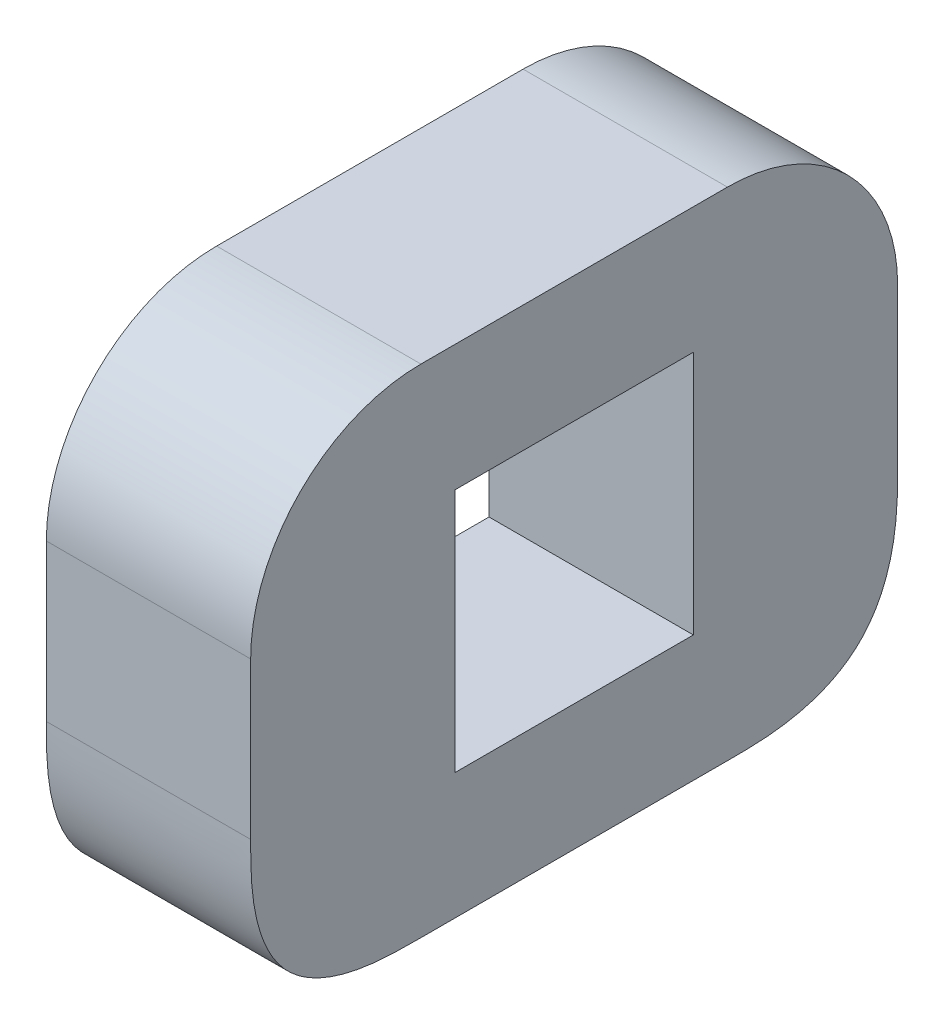
ISO-10303-21;
HEADER;
FILE_DESCRIPTION(('STEP AP214'),'2;1');
FILE_NAME('part.step','',(''),(''),'','','');
FILE_SCHEMA(('AUTOMOTIVE_DESIGN { 1 0 10303 214 1 1 1 1 }'));
ENDSEC;
DATA;
#1=APPLICATION_CONTEXT('core data for automotive mechanical design processes');
#2=APPLICATION_PROTOCOL_DEFINITION('international standard','automotive_design',2000,#1);
#3=PRODUCT_CONTEXT('',#1,'mechanical');
#4=PRODUCT('Part','Part','',(#3));
#5=PRODUCT_RELATED_PRODUCT_CATEGORY('part','',(#4));
#6=PRODUCT_DEFINITION_FORMATION('','',#4);
#7=PRODUCT_DEFINITION_CONTEXT('part definition',#1,'design');
#8=PRODUCT_DEFINITION('design','',#6,#7);
#9=PRODUCT_DEFINITION_SHAPE('','',#8);
#10=(LENGTH_UNIT() NAMED_UNIT(*) SI_UNIT(.MILLI.,.METRE.));
#11=(NAMED_UNIT(*) PLANE_ANGLE_UNIT() SI_UNIT($,.RADIAN.));
#12=(NAMED_UNIT(*) SI_UNIT($,.STERADIAN.) SOLID_ANGLE_UNIT());
#13=UNCERTAINTY_MEASURE_WITH_UNIT(LENGTH_MEASURE(1.E-05),#10,'distance_accuracy_value','');
#14=(GEOMETRIC_REPRESENTATION_CONTEXT(3) GLOBAL_UNCERTAINTY_ASSIGNED_CONTEXT((#13)) GLOBAL_UNIT_ASSIGNED_CONTEXT((#10,
#11,#12)) REPRESENTATION_CONTEXT('',''));
#15=CARTESIAN_POINT('',(0.,0.,0.));
#16=DIRECTION('',(0.,0.,1.));
#17=DIRECTION('',(1.,0.,0.));
#18=AXIS2_PLACEMENT_3D('',#15,#16,#17);
#19=CARTESIAN_POINT('',(60.6809794521981,0.909999999999997,-6.5));
#20=CARTESIAN_POINT('',(58.2809794521982,0.909999999999997,-6.5));
#21=CARTESIAN_POINT('',(55.8809794521981,0.909999999999997,-6.5));
#22=CARTESIAN_POINT('',(53.4809794521981,0.909999999999997,-6.5));
#23=CARTESIAN_POINT('',(60.6809794521981,0.0690097423302654,-6.5));
#24=CARTESIAN_POINT('',(58.2809794521981,0.0690097423307858,-6.50000000000729));
#25=CARTESIAN_POINT('',(55.8809794521982,0.0690097423307858,-6.50000000000729));
#26=CARTESIAN_POINT('',(53.4809794521981,0.0690097423302654,-6.5));
#27=CARTESIAN_POINT('',(60.6809794521981,-0.771980515339466,-6.5));
#28=CARTESIAN_POINT('',(58.2809794521981,-0.771980515339466,-6.50000000001041));
#29=CARTESIAN_POINT('',(55.8809794521982,-0.771980515339466,-6.50000000001041));
#30=CARTESIAN_POINT('',(53.4809794521981,-0.771980515339466,-6.5));
#31=CARTESIAN_POINT('',(60.6809794521981,-2.62553390593274,-6.14154040081959));
#32=CARTESIAN_POINT('',(58.2809794521981,-2.62553390593326,-6.14154040083832));
#33=CARTESIAN_POINT('',(55.8809794521982,-2.62553390593326,-6.14154040083832));
#34=CARTESIAN_POINT('',(53.4809794521981,-2.62553390593274,-6.14154040081959));
#35=CARTESIAN_POINT('',(60.6809794521981,-3.73154040081959,-5.03553390593274));
#36=CARTESIAN_POINT('',(58.2809794521981,-3.7315404008326,-5.03553390593066));
#37=CARTESIAN_POINT('',(55.8809794521982,-3.7315404008326,-5.03553390593066));
#38=CARTESIAN_POINT('',(53.4809794521981,-3.73154040081959,-5.03553390593274));
#39=CARTESIAN_POINT('',(60.6809794521981,-4.09,-3.18198051533947));
#40=CARTESIAN_POINT('',(58.2809794521982,-4.09000000001145,-3.18198051533947));
#41=CARTESIAN_POINT('',(55.8809794521981,-4.09000000001145,-3.18198051533947));
#42=CARTESIAN_POINT('',(53.4809794521981,-4.09,-3.18198051533947));
#43=CARTESIAN_POINT('',(60.6809794521981,-4.09,-2.34099025766974));
#44=CARTESIAN_POINT('',(58.2809794521982,-4.09000000000729,-2.34099025766974));
#45=CARTESIAN_POINT('',(55.8809794521981,-4.09000000000729,-2.34099025766974));
#46=CARTESIAN_POINT('',(53.4809794521981,-4.09,-2.34099025766974));
#47=CARTESIAN_POINT('',(60.6809794521981,-4.09,-1.50000000000001));
#48=CARTESIAN_POINT('',(58.2809794521982,-4.09,-1.50000000000001));
#49=CARTESIAN_POINT('',(55.8809794521981,-4.09,-1.50000000000001));
#50=CARTESIAN_POINT('',(53.4809794521981,-4.09,-1.50000000000001));
#51=B_SPLINE_SURFACE_WITH_KNOTS('',5,3,((#19,#20,#21,#22),(#23,#24,#25,#26),(#27,#28,#29,#30),
(#31,#32,#33,#34),(#35,#36,#37,#38),(#39,#40,#41,#42),(#43,#44,#45,#46),(#47,#48,#49,#50)),
.UNSPECIFIED.,.F.,.F.,.F.,(6,2,6),(4,4),(0.,0.5,1.),(-0.0006,0.0066),.UNSPECIFIED.);
#52=CARTESIAN_POINT('',(53.4809794521981,0.909999999999997,-6.5));
#53=CARTESIAN_POINT('',(55.8809794521981,0.909999999999997,-6.5));
#54=CARTESIAN_POINT('',(58.2809794521982,0.909999999999997,-6.5));
#55=CARTESIAN_POINT('',(60.6809794521981,0.909999999999997,-6.5));
#56=B_SPLINE_CURVE_WITH_KNOTS('',3,(#52,#53,#54,#55),.UNSPECIFIED.,.F.,.F.,(4,4),(-0.0006,
0.0066),.UNSPECIFIED.);
#57=CARTESIAN_POINT('',(60.0809794521981,0.910000000000005,-6.50000000000001));
#58=VERTEX_POINT('',#57);
#59=CARTESIAN_POINT('',(54.0809794521981,0.910000000000005,-6.50000000000001));
#60=VERTEX_POINT('',#59);
#61=EDGE_CURVE('E220',#58,#60,#56,.F.);
#62=CARTESIAN_POINT('',(60.0809794521981,0.909999999999997,-6.5));
#63=CARTESIAN_POINT('',(60.0809794521981,0.0690097423303846,-6.50000000000167));
#64=CARTESIAN_POINT('',(60.0809794521981,-0.771980515339466,-6.50000000000239));
#65=CARTESIAN_POINT('',(60.0809794521981,-2.62553390593286,-6.14154040082388));
#66=CARTESIAN_POINT('',(60.0809794521981,-3.73154040082257,-5.03553390593227));
#67=CARTESIAN_POINT('',(60.0809794521981,-4.09000000000263,-3.18198051533947));
#68=CARTESIAN_POINT('',(60.0809794521981,-4.09000000000167,-2.34099025766974));
#69=CARTESIAN_POINT('',(60.0809794521981,-4.09,-1.50000000000001));
#70=B_SPLINE_CURVE_WITH_KNOTS('',5,(#62,#63,#64,#65,#66,#67,#68,#69),.UNSPECIFIED.,.F.,.F.,(6,2,
6),(0.,0.5,1.),.UNSPECIFIED.);
#71=CARTESIAN_POINT('',(60.0809794521981,-4.09,-1.5));
#72=VERTEX_POINT('',#71);
#73=EDGE_CURVE('E42',#72,#58,#70,.F.);
#74=CARTESIAN_POINT('',(60.6809794521981,-4.09,-1.50000000000001));
#75=CARTESIAN_POINT('',(58.2809794521982,-4.09,-1.50000000000001));
#76=CARTESIAN_POINT('',(55.8809794521981,-4.09,-1.50000000000001));
#77=CARTESIAN_POINT('',(53.4809794521981,-4.09,-1.50000000000001));
#78=B_SPLINE_CURVE_WITH_KNOTS('',3,(#74,#75,#76,#77),.UNSPECIFIED.,.F.,.F.,(4,4),(-0.0006,
0.0066),.UNSPECIFIED.);
#79=CARTESIAN_POINT('',(54.0809794521981,-4.09,-1.5));
#80=VERTEX_POINT('',#79);
#81=EDGE_CURVE('E352',#80,#72,#78,.F.);
#82=CARTESIAN_POINT('',(54.0809794521981,-4.09,-1.50000000000001));
#83=CARTESIAN_POINT('',(54.0809794521981,-4.09000000000167,-2.34099025766974));
#84=CARTESIAN_POINT('',(54.0809794521981,-4.09000000000263,-3.18198051533947));
#85=CARTESIAN_POINT('',(54.0809794521981,-3.73154040082257,-5.03553390593227));
#86=CARTESIAN_POINT('',(54.0809794521981,-2.62553390593286,-6.14154040082388));
#87=CARTESIAN_POINT('',(54.0809794521981,-0.771980515339466,-6.50000000000239));
#88=CARTESIAN_POINT('',(54.0809794521982,0.0690097423303846,-6.50000000000167));
#89=CARTESIAN_POINT('',(54.0809794521981,0.909999999999997,-6.5));
#90=B_SPLINE_CURVE_WITH_KNOTS('',5,(#82,#83,#84,#85,#86,#87,#88,#89),.UNSPECIFIED.,.F.,.F.,(6,2,
6),(0.,0.5,1.),.UNSPECIFIED.);
#91=EDGE_CURVE('E11',#60,#80,#90,.F.);
#92=ORIENTED_EDGE('',*,*,#61,.F.);
#93=ORIENTED_EDGE('',*,*,#73,.F.);
#94=ORIENTED_EDGE('',*,*,#81,.F.);
#95=ORIENTED_EDGE('',*,*,#91,.F.);
#96=EDGE_LOOP('',(#92,#93,#94,#95));
#97=FACE_BOUND('',#96,.T.);
#98=ADVANCED_FACE('F30',(#97),#51,.T.);
#99=CARTESIAN_POINT('',(60.6809794521981,-4.09,7.5));
#100=CARTESIAN_POINT('',(58.2809794521982,-4.09,7.5));
#101=CARTESIAN_POINT('',(55.8809794521981,-4.09,7.5));
#102=CARTESIAN_POINT('',(53.4809794521981,-4.09,7.5));
#103=CARTESIAN_POINT('',(60.6809794521981,-4.09,8.34099025766973));
#104=CARTESIAN_POINT('',(58.2809794521982,-4.09000000000729,8.34099025766973));
#105=CARTESIAN_POINT('',(55.8809794521981,-4.09000000000729,8.34099025766973));
#106=CARTESIAN_POINT('',(53.4809794521981,-4.09,8.34099025766973));
#107=CARTESIAN_POINT('',(60.6809794521981,-4.09,9.18198051533946));
#108=CARTESIAN_POINT('',(58.2809794521982,-4.09000000000729,9.18198051533946));
#109=CARTESIAN_POINT('',(55.8809794521981,-4.09000000000729,9.18198051533946));
#110=CARTESIAN_POINT('',(53.4809794521981,-4.09,9.18198051533946));
#111=CARTESIAN_POINT('',(60.6809794521981,-3.73154040081959,11.0355339059327));
#112=CARTESIAN_POINT('',(58.2809794521981,-3.73154040081907,11.0355339059327));
#113=CARTESIAN_POINT('',(55.8809794521982,-3.73154040081907,11.0355339059327));
#114=CARTESIAN_POINT('',(53.4809794521981,-3.73154040081959,11.0355339059327));
#115=CARTESIAN_POINT('',(60.6809794521981,-2.62553390593274,12.1415404008196));
#116=CARTESIAN_POINT('',(58.2809794521981,-2.62553390594003,12.1415404008196));
#117=CARTESIAN_POINT('',(55.8809794521982,-2.62553390594003,12.1415404008196));
#118=CARTESIAN_POINT('',(53.4809794521981,-2.62553390593274,12.1415404008196));
#119=CARTESIAN_POINT('',(60.6809794521981,-0.771980515339468,12.5));
#120=CARTESIAN_POINT('',(58.2809794521982,-0.771980515342851,12.5));
#121=CARTESIAN_POINT('',(55.8809794521981,-0.771980515342851,12.5));
#122=CARTESIAN_POINT('',(53.4809794521981,-0.771980515339468,12.5));
#123=CARTESIAN_POINT('',(60.6809794521981,0.0690097423302641,12.5));
#124=CARTESIAN_POINT('',(58.2809794521981,0.0690097423283125,12.5));
#125=CARTESIAN_POINT('',(55.8809794521982,0.0690097423283125,12.5));
#126=CARTESIAN_POINT('',(53.4809794521981,0.0690097423302641,12.5));
#127=CARTESIAN_POINT('',(60.6809794521981,0.909999999999996,12.5));
#128=CARTESIAN_POINT('',(58.2809794521982,0.909999999999996,12.5));
#129=CARTESIAN_POINT('',(55.8809794521981,0.909999999999996,12.5));
#130=CARTESIAN_POINT('',(53.4809794521981,0.909999999999996,12.5));
#131=B_SPLINE_SURFACE_WITH_KNOTS('',5,3,((#99,#100,#101,#102),(#103,#104,#105,#106),(#107,#108,
#109,#110),(#111,#112,#113,#114),(#115,#116,#117,#118),(#119,#120,#121,#122),(#123,#124,#125,
#126),(#127,#128,#129,#130)),.UNSPECIFIED.,.F.,.F.,.F.,(6,2,6),(4,4),(0.,0.5,1.),(-0.0006,
0.0066),.UNSPECIFIED.);
#132=CARTESIAN_POINT('',(53.4809794521981,-4.09,7.5));
#133=CARTESIAN_POINT('',(55.8809794521981,-4.09,7.5));
#134=CARTESIAN_POINT('',(58.2809794521982,-4.09,7.5));
#135=CARTESIAN_POINT('',(60.6809794521981,-4.09,7.5));
#136=B_SPLINE_CURVE_WITH_KNOTS('',3,(#132,#133,#134,#135),.UNSPECIFIED.,.F.,.F.,(4,4),(-0.0006,
0.0066),.UNSPECIFIED.);
#137=CARTESIAN_POINT('',(60.0809794521981,-4.09,7.5));
#138=VERTEX_POINT('',#137);
#139=CARTESIAN_POINT('',(54.0809794521981,-4.09,7.5));
#140=VERTEX_POINT('',#139);
#141=EDGE_CURVE('E208',#138,#140,#136,.F.);
#142=CARTESIAN_POINT('',(60.0809794521982,-4.09,7.5));
#143=CARTESIAN_POINT('',(60.0809794521982,-4.09000000000167,8.34099025766973));
#144=CARTESIAN_POINT('',(60.0809794521982,-4.09000000000167,9.18198051533946));
#145=CARTESIAN_POINT('',(60.0809794521982,-3.73154040081947,11.0355339059327));
#146=CARTESIAN_POINT('',(60.0809794521981,-2.62553390593441,12.1415404008196));
#147=CARTESIAN_POINT('',(60.0809794521982,-0.771980515340243,12.5));
#148=CARTESIAN_POINT('',(60.0809794521981,0.0690097423298168,12.5));
#149=CARTESIAN_POINT('',(60.0809794521982,0.909999999999996,12.5));
#150=B_SPLINE_CURVE_WITH_KNOTS('',5,(#142,#143,#144,#145,#146,#147,#148,#149),.UNSPECIFIED.,.F.,
.F.,(6,2,6),(0.,0.5,1.),.UNSPECIFIED.);
#151=CARTESIAN_POINT('',(60.0809794521981,0.909999999999996,12.5));
#152=VERTEX_POINT('',#151);
#153=EDGE_CURVE('E221',#152,#138,#150,.F.);
#154=CARTESIAN_POINT('',(60.6809794521981,0.909999999999996,12.5));
#155=CARTESIAN_POINT('',(58.2809794521982,0.909999999999996,12.5));
#156=CARTESIAN_POINT('',(55.8809794521981,0.909999999999996,12.5));
#157=CARTESIAN_POINT('',(53.4809794521981,0.909999999999996,12.5));
#158=B_SPLINE_CURVE_WITH_KNOTS('',3,(#154,#155,#156,#157),.UNSPECIFIED.,.F.,.F.,(4,4),(-0.0006,
0.0066),.UNSPECIFIED.);
#159=CARTESIAN_POINT('',(54.0809794521981,0.909999999999996,12.5));
#160=VERTEX_POINT('',#159);
#161=EDGE_CURVE('E212',#160,#152,#158,.F.);
#162=CARTESIAN_POINT('',(54.0809794521981,0.909999999999996,12.5));
#163=CARTESIAN_POINT('',(54.0809794521982,0.0690097423298168,12.5));
#164=CARTESIAN_POINT('',(54.0809794521981,-0.771980515340243,12.5));
#165=CARTESIAN_POINT('',(54.0809794521981,-2.62553390593441,12.1415404008196));
#166=CARTESIAN_POINT('',(54.0809794521981,-3.73154040081947,11.0355339059327));
#167=CARTESIAN_POINT('',(54.0809794521981,-4.09000000000167,9.18198051533946));
#168=CARTESIAN_POINT('',(54.0809794521981,-4.09000000000167,8.34099025766973));
#169=CARTESIAN_POINT('',(54.0809794521981,-4.09,7.5));
#170=B_SPLINE_CURVE_WITH_KNOTS('',5,(#162,#163,#164,#165,#166,#167,#168,#169),.UNSPECIFIED.,.F.,
.F.,(6,2,6),(0.,0.5,1.),.UNSPECIFIED.);
#171=EDGE_CURVE('E216',#140,#160,#170,.F.);
#172=ORIENTED_EDGE('',*,*,#141,.F.);
#173=ORIENTED_EDGE('',*,*,#153,.F.);
#174=ORIENTED_EDGE('',*,*,#161,.F.);
#175=ORIENTED_EDGE('',*,*,#171,.F.);
#176=EDGE_LOOP('',(#172,#173,#174,#175));
#177=FACE_BOUND('',#176,.T.);
#178=ADVANCED_FACE('F225',(#177),#131,.T.);
#179=CARTESIAN_POINT('',(60.0809794521981,-4.09000000000001,12.5));
#180=DIRECTION('',(1.,0.,0.));
#181=DIRECTION('',(0.,0.,-1.));
#182=AXIS2_PLACEMENT_3D('',#179,#180,#181);
#183=PLANE('',#182);
#184=DIRECTION('',(0.,0.,-1.));
#185=VECTOR('',#184,1.);
#186=CARTESIAN_POINT('',(60.0809794521981,-4.09000000000001,12.5));
#187=LINE('',#186,#185);
#188=EDGE_CURVE('E175',#138,#72,#187,.T.);
#189=ORIENTED_EDGE('',*,*,#188,.T.);
#190=ORIENTED_EDGE('',*,*,#73,.T.);
#191=DIRECTION('',(0.,1.,0.));
#192=VECTOR('',#191,1.);
#193=CARTESIAN_POINT('',(60.0809794521981,10.5,-6.5));
#194=LINE('',#193,#192);
#195=CARTESIAN_POINT('',(60.0809794521981,5.5,-6.5));
#196=VERTEX_POINT('',#195);
#197=EDGE_CURVE('E203',#58,#196,#194,.T.);
#198=ORIENTED_EDGE('',*,*,#197,.T.);
#199=CARTESIAN_POINT('',(60.0809794521981,5.5,-1.5));
#200=DIRECTION('',(1.,0.,0.));
#201=DIRECTION('',(0.,0.,-1.));
#202=AXIS2_PLACEMENT_3D('',#199,#200,#201);
#203=CIRCLE('',#202,5.);
#204=CARTESIAN_POINT('',(60.0809794521981,10.5,-1.5));
#205=VERTEX_POINT('',#204);
#206=EDGE_CURVE('E236',#196,#205,#203,.T.);
#207=ORIENTED_EDGE('',*,*,#206,.T.);
#208=DIRECTION('',(0.,0.,1.));
#209=VECTOR('',#208,1.);
#210=CARTESIAN_POINT('',(60.0809794521981,10.5,12.5));
#211=LINE('',#210,#209);
#212=CARTESIAN_POINT('',(60.0809794521981,10.5,7.5));
#213=VERTEX_POINT('',#212);
#214=EDGE_CURVE('E190',#205,#213,#211,.T.);
#215=ORIENTED_EDGE('',*,*,#214,.T.);
#216=CARTESIAN_POINT('',(60.0809794521981,5.5,7.5));
#217=DIRECTION('',(1.,0.,0.));
#218=DIRECTION('',(0.,0.,-1.));
#219=AXIS2_PLACEMENT_3D('',#216,#217,#218);
#220=CIRCLE('',#219,5.);
#221=CARTESIAN_POINT('',(60.0809794521981,5.5,12.5));
#222=VERTEX_POINT('',#221);
#223=EDGE_CURVE('E237',#213,#222,#220,.T.);
#224=ORIENTED_EDGE('',*,*,#223,.T.);
#225=DIRECTION('',(0.,-1.,0.));
#226=VECTOR('',#225,1.);
#227=CARTESIAN_POINT('',(60.0809794521981,10.5,12.5));
#228=LINE('',#227,#226);
#229=EDGE_CURVE('E171',#222,#152,#228,.T.);
#230=ORIENTED_EDGE('',*,*,#229,.T.);
#231=ORIENTED_EDGE('',*,*,#153,.T.);
#232=EDGE_LOOP('',(#189,#190,#198,#207,#215,#224,#230,#231));
#233=FACE_BOUND('',#232,.T.);
#234=DIRECTION('',(0.,0.,-1.));
#235=VECTOR('',#234,1.);
#236=CARTESIAN_POINT('',(60.0809794521981,-0.390000000000003,6.5));
#237=LINE('',#236,#235);
#238=CARTESIAN_POINT('',(60.0809794521981,-0.390000000000003,6.5));
#239=VERTEX_POINT('',#238);
#240=CARTESIAN_POINT('',(60.0809794521981,-0.390000000000002,-0.500000000000001));
#241=VERTEX_POINT('',#240);
#242=EDGE_CURVE('E134',#239,#241,#237,.T.);
#243=ORIENTED_EDGE('',*,*,#242,.F.);
#244=DIRECTION('',(0.,-1.,0.));
#245=VECTOR('',#244,1.);
#246=CARTESIAN_POINT('',(60.0809794521981,6.8,6.5));
#247=LINE('',#246,#245);
#248=CARTESIAN_POINT('',(60.0809794521981,6.8,6.5));
#249=VERTEX_POINT('',#248);
#250=EDGE_CURVE('E124',#249,#239,#247,.T.);
#251=ORIENTED_EDGE('',*,*,#250,.F.);
#252=DIRECTION('',(0.,0.,1.));
#253=VECTOR('',#252,1.);
#254=CARTESIAN_POINT('',(60.0809794521981,6.8,6.5));
#255=LINE('',#254,#253);
#256=CARTESIAN_POINT('',(60.0809794521981,6.8,-0.5));
#257=VERTEX_POINT('',#256);
#258=EDGE_CURVE('E150',#257,#249,#255,.T.);
#259=ORIENTED_EDGE('',*,*,#258,.F.);
#260=DIRECTION('',(0.,1.,0.));
#261=VECTOR('',#260,1.);
#262=CARTESIAN_POINT('',(60.0809794521981,6.8,-0.5));
#263=LINE('',#262,#261);
#264=EDGE_CURVE('E148',#241,#257,#263,.T.);
#265=ORIENTED_EDGE('',*,*,#264,.F.);
#266=EDGE_LOOP('',(#243,#251,#259,#265));
#267=FACE_BOUND('',#266,.T.);
#268=ADVANCED_FACE('F146',(#233,#267),#183,.T.);
#269=CARTESIAN_POINT('',(54.0809794521981,-4.09000000000001,12.5));
#270=DIRECTION('',(1.,0.,0.));
#271=DIRECTION('',(0.,0.,-1.));
#272=AXIS2_PLACEMENT_3D('',#269,#270,#271);
#273=PLANE('',#272);
#274=DIRECTION('',(0.,1.,0.));
#275=VECTOR('',#274,1.);
#276=CARTESIAN_POINT('',(54.0809794521981,10.5,-6.5));
#277=LINE('',#276,#275);
#278=CARTESIAN_POINT('',(54.0809794521981,5.5,-6.5));
#279=VERTEX_POINT('',#278);
#280=EDGE_CURVE('E199',#60,#279,#277,.T.);
#281=ORIENTED_EDGE('',*,*,#280,.F.);
#282=ORIENTED_EDGE('',*,*,#91,.T.);
#283=DIRECTION('',(0.,0.,-1.));
#284=VECTOR('',#283,1.);
#285=CARTESIAN_POINT('',(54.0809794521981,-4.09000000000001,12.5));
#286=LINE('',#285,#284);
#287=EDGE_CURVE('E184',#140,#80,#286,.T.);
#288=ORIENTED_EDGE('',*,*,#287,.F.);
#289=ORIENTED_EDGE('',*,*,#171,.T.);
#290=DIRECTION('',(0.,-1.,0.));
#291=VECTOR('',#290,1.);
#292=CARTESIAN_POINT('',(54.0809794521981,10.5,12.5));
#293=LINE('',#292,#291);
#294=CARTESIAN_POINT('',(54.0809794521981,5.5,12.5));
#295=VERTEX_POINT('',#294);
#296=EDGE_CURVE('E142',#295,#160,#293,.T.);
#297=ORIENTED_EDGE('',*,*,#296,.F.);
#298=CARTESIAN_POINT('',(54.0809794521981,5.5,7.5));
#299=DIRECTION('',(1.,0.,0.));
#300=DIRECTION('',(0.,0.,-1.));
#301=AXIS2_PLACEMENT_3D('',#298,#299,#300);
#302=CIRCLE('',#301,5.);
#303=CARTESIAN_POINT('',(54.0809794521981,10.5,7.5));
#304=VERTEX_POINT('',#303);
#305=EDGE_CURVE('E250',#295,#304,#302,.F.);
#306=ORIENTED_EDGE('',*,*,#305,.T.);
#307=DIRECTION('',(0.,0.,1.));
#308=VECTOR('',#307,1.);
#309=CARTESIAN_POINT('',(54.0809794521981,10.5,12.5));
#310=LINE('',#309,#308);
#311=CARTESIAN_POINT('',(54.0809794521981,10.5,-1.5));
#312=VERTEX_POINT('',#311);
#313=EDGE_CURVE('E176',#312,#304,#310,.T.);
#314=ORIENTED_EDGE('',*,*,#313,.F.);
#315=CARTESIAN_POINT('',(54.0809794521981,5.5,-1.5));
#316=DIRECTION('',(1.,0.,0.));
#317=DIRECTION('',(0.,0.,-1.));
#318=AXIS2_PLACEMENT_3D('',#315,#316,#317);
#319=CIRCLE('',#318,5.);
#320=EDGE_CURVE('E247',#312,#279,#319,.F.);
#321=ORIENTED_EDGE('',*,*,#320,.T.);
#322=EDGE_LOOP('',(#281,#282,#288,#289,#297,#306,#314,#321));
#323=FACE_BOUND('',#322,.T.);
#324=DIRECTION('',(0.,-1.,0.));
#325=VECTOR('',#324,1.);
#326=CARTESIAN_POINT('',(54.0809794521981,6.8,6.5));
#327=LINE('',#326,#325);
#328=CARTESIAN_POINT('',(54.0809794521981,6.8,6.5));
#329=VERTEX_POINT('',#328);
#330=CARTESIAN_POINT('',(54.0809794521981,-0.390000000000003,6.5));
#331=VERTEX_POINT('',#330);
#332=EDGE_CURVE('E154',#329,#331,#327,.T.);
#333=ORIENTED_EDGE('',*,*,#332,.T.);
#334=DIRECTION('',(0.,0.,-1.));
#335=VECTOR('',#334,1.);
#336=CARTESIAN_POINT('',(54.0809794521981,-0.390000000000003,6.5));
#337=LINE('',#336,#335);
#338=CARTESIAN_POINT('',(54.0809794521981,-0.390000000000002,-0.500000000000001));
#339=VERTEX_POINT('',#338);
#340=EDGE_CURVE('E141',#331,#339,#337,.T.);
#341=ORIENTED_EDGE('',*,*,#340,.T.);
#342=DIRECTION('',(0.,1.,0.));
#343=VECTOR('',#342,1.);
#344=CARTESIAN_POINT('',(54.0809794521981,6.8,-0.5));
#345=LINE('',#344,#343);
#346=CARTESIAN_POINT('',(54.0809794521981,6.8,-0.5));
#347=VERTEX_POINT('',#346);
#348=EDGE_CURVE('E157',#339,#347,#345,.T.);
#349=ORIENTED_EDGE('',*,*,#348,.T.);
#350=DIRECTION('',(0.,0.,1.));
#351=VECTOR('',#350,1.);
#352=CARTESIAN_POINT('',(54.0809794521981,6.8,6.5));
#353=LINE('',#352,#351);
#354=EDGE_CURVE('E135',#347,#329,#353,.T.);
#355=ORIENTED_EDGE('',*,*,#354,.T.);
#356=EDGE_LOOP('',(#333,#341,#349,#355));
#357=FACE_BOUND('',#356,.T.);
#358=ADVANCED_FACE('F213',(#323,#357),#273,.F.);
#359=CARTESIAN_POINT('',(60.0809794521981,10.5,12.5));
#360=DIRECTION('',(0.,0.,-1.));
#361=DIRECTION('',(-1.,0.,0.));
#362=AXIS2_PLACEMENT_3D('',#359,#360,#361);
#363=PLANE('',#362);
#364=ORIENTED_EDGE('',*,*,#296,.T.);
#365=ORIENTED_EDGE('',*,*,#161,.T.);
#366=ORIENTED_EDGE('',*,*,#229,.F.);
#367=DIRECTION('',(-1.,0.,0.));
#368=VECTOR('',#367,1.);
#369=CARTESIAN_POINT('',(60.0809794521981,5.5,12.5));
#370=LINE('',#369,#368);
#371=EDGE_CURVE('E200',#222,#295,#370,.T.);
#372=ORIENTED_EDGE('',*,*,#371,.T.);
#373=EDGE_LOOP('',(#364,#365,#366,#372));
#374=FACE_BOUND('',#373,.T.);
#375=ADVANCED_FACE('F232',(#374),#363,.F.);
#376=CARTESIAN_POINT('',(60.0809794521981,-4.09000000000001,12.5));
#377=DIRECTION('',(0.,1.,0.));
#378=DIRECTION('',(0.,0.,1.));
#379=AXIS2_PLACEMENT_3D('',#376,#377,#378);
#380=PLANE('',#379);
#381=ORIENTED_EDGE('',*,*,#287,.T.);
#382=ORIENTED_EDGE('',*,*,#81,.T.);
#383=ORIENTED_EDGE('',*,*,#188,.F.);
#384=ORIENTED_EDGE('',*,*,#141,.T.);
#385=EDGE_LOOP('',(#381,#382,#383,#384));
#386=FACE_BOUND('',#385,.T.);
#387=ADVANCED_FACE('F209',(#386),#380,.F.);
#388=CARTESIAN_POINT('',(60.0809794521981,10.5,-6.5));
#389=DIRECTION('',(0.,0.,1.));
#390=DIRECTION('',(0.,-1.,0.));
#391=AXIS2_PLACEMENT_3D('',#388,#389,#390);
#392=PLANE('',#391);
#393=ORIENTED_EDGE('',*,*,#197,.F.);
#394=ORIENTED_EDGE('',*,*,#61,.T.);
#395=ORIENTED_EDGE('',*,*,#280,.T.);
#396=DIRECTION('',(-1.,0.,0.));
#397=VECTOR('',#396,1.);
#398=CARTESIAN_POINT('',(60.0809794521981,5.5,-6.5));
#399=LINE('',#398,#397);
#400=EDGE_CURVE('E242',#279,#196,#399,.F.);
#401=ORIENTED_EDGE('',*,*,#400,.T.);
#402=EDGE_LOOP('',(#393,#394,#395,#401));
#403=FACE_BOUND('',#402,.T.);
#404=ADVANCED_FACE('F276',(#403),#392,.F.);
#405=CARTESIAN_POINT('',(60.0809794521981,10.5,12.5));
#406=DIRECTION('',(0.,-1.,0.));
#407=DIRECTION('',(0.,0.,-1.));
#408=AXIS2_PLACEMENT_3D('',#405,#406,#407);
#409=PLANE('',#408);
#410=ORIENTED_EDGE('',*,*,#214,.F.);
#411=DIRECTION('',(-1.,0.,0.));
#412=VECTOR('',#411,1.);
#413=CARTESIAN_POINT('',(60.0809794521981,10.5,-1.5));
#414=LINE('',#413,#412);
#415=EDGE_CURVE('E252',#205,#312,#414,.T.);
#416=ORIENTED_EDGE('',*,*,#415,.T.);
#417=ORIENTED_EDGE('',*,*,#313,.T.);
#418=DIRECTION('',(-1.,0.,0.));
#419=VECTOR('',#418,1.);
#420=CARTESIAN_POINT('',(60.0809794521981,10.5,7.5));
#421=LINE('',#420,#419);
#422=EDGE_CURVE('E255',#304,#213,#421,.F.);
#423=ORIENTED_EDGE('',*,*,#422,.T.);
#424=EDGE_LOOP('',(#410,#416,#417,#423));
#425=FACE_BOUND('',#424,.T.);
#426=ADVANCED_FACE('F285',(#425),#409,.F.);
#427=CARTESIAN_POINT('',(60.0809794521981,6.8,6.5));
#428=DIRECTION('',(0.,0.,-1.));
#429=DIRECTION('',(-1.,0.,0.));
#430=AXIS2_PLACEMENT_3D('',#427,#428,#429);
#431=PLANE('',#430);
#432=ORIENTED_EDGE('',*,*,#332,.F.);
#433=DIRECTION('',(-1.,0.,0.));
#434=VECTOR('',#433,1.);
#435=CARTESIAN_POINT('',(60.0809794521981,6.8,6.5));
#436=LINE('',#435,#434);
#437=EDGE_CURVE('E130',#249,#329,#436,.T.);
#438=ORIENTED_EDGE('',*,*,#437,.F.);
#439=ORIENTED_EDGE('',*,*,#250,.T.);
#440=DIRECTION('',(-1.,0.,0.));
#441=VECTOR('',#440,1.);
#442=CARTESIAN_POINT('',(60.0809794521981,-0.390000000000003,6.5));
#443=LINE('',#442,#441);
#444=EDGE_CURVE('E127',#239,#331,#443,.T.);
#445=ORIENTED_EDGE('',*,*,#444,.T.);
#446=EDGE_LOOP('',(#432,#438,#439,#445));
#447=FACE_BOUND('',#446,.T.);
#448=ADVANCED_FACE('F126',(#447),#431,.T.);
#449=CARTESIAN_POINT('',(60.0809794521981,-0.390000000000003,6.5));
#450=DIRECTION('',(0.,1.,0.));
#451=DIRECTION('',(0.,0.,1.));
#452=AXIS2_PLACEMENT_3D('',#449,#450,#451);
#453=PLANE('',#452);
#454=ORIENTED_EDGE('',*,*,#340,.F.);
#455=ORIENTED_EDGE('',*,*,#444,.F.);
#456=ORIENTED_EDGE('',*,*,#242,.T.);
#457=DIRECTION('',(-1.,0.,0.));
#458=VECTOR('',#457,1.);
#459=CARTESIAN_POINT('',(60.0809794521981,-0.390000000000002,-0.500000000000001));
#460=LINE('',#459,#458);
#461=EDGE_CURVE('E143',#241,#339,#460,.T.);
#462=ORIENTED_EDGE('',*,*,#461,.T.);
#463=EDGE_LOOP('',(#454,#455,#456,#462));
#464=FACE_BOUND('',#463,.T.);
#465=ADVANCED_FACE('F138',(#464),#453,.T.);
#466=CARTESIAN_POINT('',(60.0809794521981,6.8,-0.5));
#467=DIRECTION('',(0.,0.,1.));
#468=DIRECTION('',(0.,-1.,0.));
#469=AXIS2_PLACEMENT_3D('',#466,#467,#468);
#470=PLANE('',#469);
#471=ORIENTED_EDGE('',*,*,#348,.F.);
#472=ORIENTED_EDGE('',*,*,#461,.F.);
#473=ORIENTED_EDGE('',*,*,#264,.T.);
#474=DIRECTION('',(-1.,0.,0.));
#475=VECTOR('',#474,1.);
#476=CARTESIAN_POINT('',(60.0809794521981,6.8,-0.5));
#477=LINE('',#476,#475);
#478=EDGE_CURVE('E163',#257,#347,#477,.T.);
#479=ORIENTED_EDGE('',*,*,#478,.T.);
#480=EDGE_LOOP('',(#471,#472,#473,#479));
#481=FACE_BOUND('',#480,.T.);
#482=ADVANCED_FACE('F344',(#481),#470,.T.);
#483=CARTESIAN_POINT('',(60.0809794521981,6.8,6.5));
#484=DIRECTION('',(0.,-1.,0.));
#485=DIRECTION('',(0.,0.,-1.));
#486=AXIS2_PLACEMENT_3D('',#483,#484,#485);
#487=PLANE('',#486);
#488=ORIENTED_EDGE('',*,*,#354,.F.);
#489=ORIENTED_EDGE('',*,*,#478,.F.);
#490=ORIENTED_EDGE('',*,*,#258,.T.);
#491=ORIENTED_EDGE('',*,*,#437,.T.);
#492=EDGE_LOOP('',(#488,#489,#490,#491));
#493=FACE_BOUND('',#492,.T.);
#494=ADVANCED_FACE('F338',(#493),#487,.T.);
#495=CARTESIAN_POINT('',(60.0809794521981,5.5,-1.5));
#496=DIRECTION('',(-1.,0.,0.));
#497=DIRECTION('',(0.,0.,1.));
#498=AXIS2_PLACEMENT_3D('',#495,#496,#497);
#499=CYLINDRICAL_SURFACE('',#498,5.);
#500=ORIENTED_EDGE('',*,*,#206,.F.);
#501=ORIENTED_EDGE('',*,*,#400,.F.);
#502=ORIENTED_EDGE('',*,*,#320,.F.);
#503=ORIENTED_EDGE('',*,*,#415,.F.);
#504=EDGE_LOOP('',(#500,#501,#502,#503));
#505=FACE_BOUND('',#504,.T.);
#506=ADVANCED_FACE('F335',(#505),#499,.T.);
#507=CARTESIAN_POINT('',(60.0809794521981,5.5,7.5));
#508=DIRECTION('',(-1.,0.,0.));
#509=DIRECTION('',(0.,0.,1.));
#510=AXIS2_PLACEMENT_3D('',#507,#508,#509);
#511=CYLINDRICAL_SURFACE('',#510,5.);
#512=ORIENTED_EDGE('',*,*,#223,.F.);
#513=ORIENTED_EDGE('',*,*,#422,.F.);
#514=ORIENTED_EDGE('',*,*,#305,.F.);
#515=ORIENTED_EDGE('',*,*,#371,.F.);
#516=EDGE_LOOP('',(#512,#513,#514,#515));
#517=FACE_BOUND('',#516,.T.);
#518=ADVANCED_FACE('F332',(#517),#511,.T.);
#519=CLOSED_SHELL('',(#98,#178,#268,#358,#375,#387,#404,#426,#448,#465,#482,#494,#506,#518));
#520=MANIFOLD_SOLID_BREP('B2',#519);
#521=ADVANCED_BREP_SHAPE_REPRESENTATION('',(#18,#520),#14);
#522=SHAPE_DEFINITION_REPRESENTATION(#9,#521);
ENDSEC;
END-ISO-10303-21;
